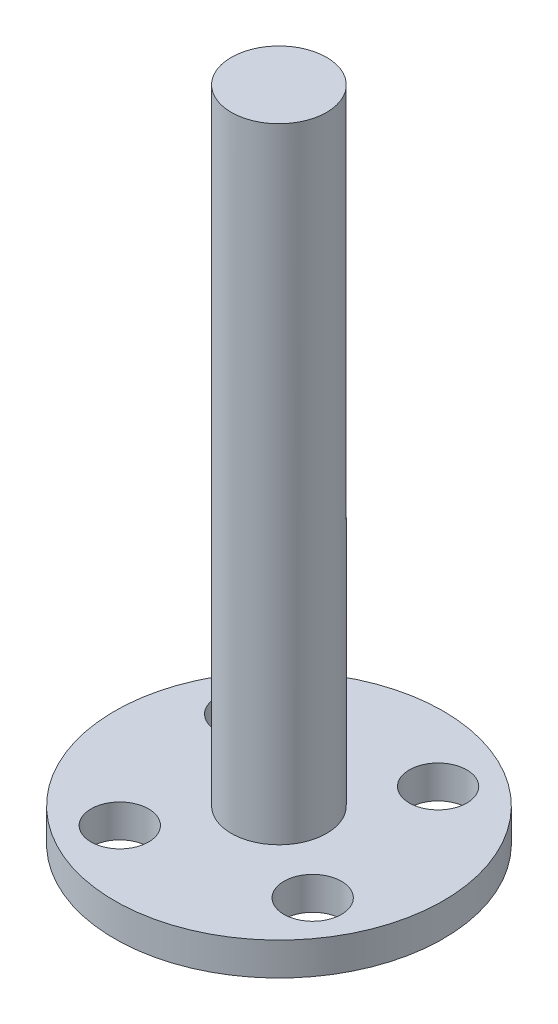
ISO-10303-21;
HEADER;
FILE_DESCRIPTION(('STEP AP214'),'2;1');
FILE_NAME('part.step','',(''),(''),'','','');
FILE_SCHEMA(('AUTOMOTIVE_DESIGN { 1 0 10303 214 1 1 1 1 }'));
ENDSEC;
DATA;
#1=APPLICATION_CONTEXT('core data for automotive mechanical design processes');
#2=APPLICATION_PROTOCOL_DEFINITION('international standard','automotive_design',2000,#1);
#3=PRODUCT_CONTEXT('',#1,'mechanical');
#4=PRODUCT('Part','Part','',(#3));
#5=PRODUCT_RELATED_PRODUCT_CATEGORY('part','',(#4));
#6=PRODUCT_DEFINITION_FORMATION('','',#4);
#7=PRODUCT_DEFINITION_CONTEXT('part definition',#1,'design');
#8=PRODUCT_DEFINITION('design','',#6,#7);
#9=PRODUCT_DEFINITION_SHAPE('','',#8);
#10=(LENGTH_UNIT() NAMED_UNIT(*) SI_UNIT(.MILLI.,.METRE.));
#11=(NAMED_UNIT(*) PLANE_ANGLE_UNIT() SI_UNIT($,.RADIAN.));
#12=(NAMED_UNIT(*) SI_UNIT($,.STERADIAN.) SOLID_ANGLE_UNIT());
#13=UNCERTAINTY_MEASURE_WITH_UNIT(LENGTH_MEASURE(1.E-05),#10,'distance_accuracy_value','');
#14=(GEOMETRIC_REPRESENTATION_CONTEXT(3) GLOBAL_UNCERTAINTY_ASSIGNED_CONTEXT((#13)) GLOBAL_UNIT_ASSIGNED_CONTEXT((#10,
#11,#12)) REPRESENTATION_CONTEXT('',''));
#15=CARTESIAN_POINT('',(0.,0.,0.));
#16=DIRECTION('',(0.,0.,1.));
#17=DIRECTION('',(1.,0.,0.));
#18=AXIS2_PLACEMENT_3D('',#15,#16,#17);
#19=CARTESIAN_POINT('',(0.,40.,0.));
#20=DIRECTION('',(0.,-1.,0.));
#21=DIRECTION('',(0.,0.,-1.));
#22=AXIS2_PLACEMENT_3D('',#19,#20,#21);
#23=CYLINDRICAL_SURFACE('',#22,2.9);
#24=CARTESIAN_POINT('',(0.,40.,0.));
#25=DIRECTION('',(0.,1.,0.));
#26=DIRECTION('',(0.,0.,1.));
#27=AXIS2_PLACEMENT_3D('',#24,#25,#26);
#28=CIRCLE('',#27,2.9);
#29=CARTESIAN_POINT('',(0.,40.,2.9));
#30=VERTEX_POINT('',#29);
#31=EDGE_CURVE('E44',#30,#30,#28,.T.);
#32=ORIENTED_EDGE('',*,*,#31,.F.);
#33=EDGE_LOOP('',(#32));
#34=FACE_BOUND('',#33,.T.);
#35=CARTESIAN_POINT('',(0.,2.,0.));
#36=DIRECTION('',(0.,-1.,0.));
#37=DIRECTION('',(0.,0.,-1.));
#38=AXIS2_PLACEMENT_3D('',#35,#36,#37);
#39=CIRCLE('',#38,2.9);
#40=CARTESIAN_POINT('',(0.,2.,-2.9));
#41=VERTEX_POINT('',#40);
#42=EDGE_CURVE('E10',#41,#41,#39,.T.);
#43=ORIENTED_EDGE('',*,*,#42,.F.);
#44=EDGE_LOOP('',(#43));
#45=FACE_BOUND('',#44,.T.);
#46=ADVANCED_FACE('F37',(#34,#45),#23,.T.);
#47=CARTESIAN_POINT('',(0.,40.,0.));
#48=DIRECTION('',(0.,1.,0.));
#49=DIRECTION('',(0.,0.,1.));
#50=AXIS2_PLACEMENT_3D('',#47,#48,#49);
#51=PLANE('',#50);
#52=ORIENTED_EDGE('',*,*,#31,.T.);
#53=EDGE_LOOP('',(#52));
#54=FACE_BOUND('',#53,.T.);
#55=ADVANCED_FACE('F101',(#54),#51,.T.);
#56=CARTESIAN_POINT('',(0.,2.,0.));
#57=DIRECTION('',(0.,-1.,0.));
#58=DIRECTION('',(0.,0.,-1.));
#59=AXIS2_PLACEMENT_3D('',#56,#57,#58);
#60=CYLINDRICAL_SURFACE('',#59,10.);
#61=CARTESIAN_POINT('',(0.,2.,0.));
#62=DIRECTION('',(0.,-1.,0.));
#63=DIRECTION('',(0.,0.,-1.));
#64=AXIS2_PLACEMENT_3D('',#61,#62,#63);
#65=CIRCLE('',#64,10.);
#66=CARTESIAN_POINT('',(0.,2.,-10.));
#67=VERTEX_POINT('',#66);
#68=EDGE_CURVE('E49',#67,#67,#65,.T.);
#69=ORIENTED_EDGE('',*,*,#68,.T.);
#70=EDGE_LOOP('',(#69));
#71=FACE_BOUND('',#70,.T.);
#72=CARTESIAN_POINT('',(0.,0.,0.));
#73=DIRECTION('',(0.,-1.,0.));
#74=DIRECTION('',(0.,0.,-1.));
#75=AXIS2_PLACEMENT_3D('',#72,#73,#74);
#76=CIRCLE('',#75,10.);
#77=CARTESIAN_POINT('',(0.,0.,-10.));
#78=VERTEX_POINT('',#77);
#79=EDGE_CURVE('E64',#78,#78,#76,.T.);
#80=ORIENTED_EDGE('',*,*,#79,.F.);
#81=EDGE_LOOP('',(#80));
#82=FACE_BOUND('',#81,.T.);
#83=ADVANCED_FACE('F92',(#71,#82),#60,.T.);
#84=CARTESIAN_POINT('',(0.,2.,0.));
#85=DIRECTION('',(0.,-1.,0.));
#86=DIRECTION('',(0.,0.,-1.));
#87=AXIS2_PLACEMENT_3D('',#84,#85,#86);
#88=PLANE('',#87);
#89=CARTESIAN_POINT('',(5.86939843416738,2.,3.81450466811861));
#90=DIRECTION('',(0.,1.,0.));
#91=DIRECTION('',(0.,0.,1.));
#92=AXIS2_PLACEMENT_3D('',#89,#90,#91);
#93=CIRCLE('',#92,1.75);
#94=CARTESIAN_POINT('',(5.86939843416738,2.,5.56450466811861));
#95=VERTEX_POINT('',#94);
#96=EDGE_CURVE('E76',#95,#95,#93,.T.);
#97=ORIENTED_EDGE('',*,*,#96,.F.);
#98=EDGE_LOOP('',(#97));
#99=FACE_BOUND('',#98,.T.);
#100=CARTESIAN_POINT('',(3.8145046681184,2.,-5.869398434167));
#101=DIRECTION('',(0.,1.,0.));
#102=DIRECTION('',(0.,0.,1.));
#103=AXIS2_PLACEMENT_3D('',#100,#101,#102);
#104=CIRCLE('',#103,1.75);
#105=CARTESIAN_POINT('',(3.8145046681184,2.,-4.119398434167));
#106=VERTEX_POINT('',#105);
#107=EDGE_CURVE('E79',#106,#106,#104,.T.);
#108=ORIENTED_EDGE('',*,*,#107,.F.);
#109=EDGE_LOOP('',(#108));
#110=FACE_BOUND('',#109,.T.);
#111=CARTESIAN_POINT('',(-5.86939843416722,2.,-3.81450466811802));
#112=DIRECTION('',(0.,1.,0.));
#113=DIRECTION('',(0.,0.,1.));
#114=AXIS2_PLACEMENT_3D('',#111,#112,#113);
#115=CIRCLE('',#114,1.74999999999821);
#116=CARTESIAN_POINT('',(-5.86939843416722,2.,-2.06450466811981));
#117=VERTEX_POINT('',#116);
#118=EDGE_CURVE('E75',#117,#117,#115,.T.);
#119=ORIENTED_EDGE('',*,*,#118,.F.);
#120=EDGE_LOOP('',(#119));
#121=FACE_BOUND('',#120,.T.);
#122=CARTESIAN_POINT('',(-3.81450466811824,2.,5.86939843416759));
#123=DIRECTION('',(0.,1.,0.));
#124=DIRECTION('',(0.,0.,1.));
#125=AXIS2_PLACEMENT_3D('',#122,#123,#124);
#126=CIRCLE('',#125,1.75);
#127=CARTESIAN_POINT('',(-3.81450466811824,2.,7.61939843416759));
#128=VERTEX_POINT('',#127);
#129=EDGE_CURVE('E57',#128,#128,#126,.T.);
#130=ORIENTED_EDGE('',*,*,#129,.F.);
#131=EDGE_LOOP('',(#130));
#132=FACE_BOUND('',#131,.T.);
#133=ORIENTED_EDGE('',*,*,#42,.T.);
#134=EDGE_LOOP('',(#133));
#135=FACE_BOUND('',#134,.T.);
#136=ORIENTED_EDGE('',*,*,#68,.F.);
#137=EDGE_LOOP('',(#136));
#138=FACE_BOUND('',#137,.T.);
#139=ADVANCED_FACE('F88',(#99,#110,#121,#132,#135,#138),#88,.F.);
#140=CARTESIAN_POINT('',(0.,0.,0.));
#141=DIRECTION('',(0.,1.,0.));
#142=DIRECTION('',(0.,0.,1.));
#143=AXIS2_PLACEMENT_3D('',#140,#141,#142);
#144=PLANE('',#143);
#145=CARTESIAN_POINT('',(5.86939843416738,0.,3.81450466811861));
#146=DIRECTION('',(0.,1.,0.));
#147=DIRECTION('',(0.,0.,1.));
#148=AXIS2_PLACEMENT_3D('',#145,#146,#147);
#149=CIRCLE('',#148,1.75);
#150=CARTESIAN_POINT('',(5.86939843416738,0.,5.56450466811861));
#151=VERTEX_POINT('',#150);
#152=EDGE_CURVE('E40',#151,#151,#149,.T.);
#153=ORIENTED_EDGE('',*,*,#152,.T.);
#154=EDGE_LOOP('',(#153));
#155=FACE_BOUND('',#154,.T.);
#156=CARTESIAN_POINT('',(3.8145046681184,0.,-5.869398434167));
#157=DIRECTION('',(0.,1.,0.));
#158=DIRECTION('',(0.,0.,1.));
#159=AXIS2_PLACEMENT_3D('',#156,#157,#158);
#160=CIRCLE('',#159,1.75);
#161=CARTESIAN_POINT('',(3.8145046681184,0.,-4.119398434167));
#162=VERTEX_POINT('',#161);
#163=EDGE_CURVE('E59',#162,#162,#160,.T.);
#164=ORIENTED_EDGE('',*,*,#163,.T.);
#165=EDGE_LOOP('',(#164));
#166=FACE_BOUND('',#165,.T.);
#167=CARTESIAN_POINT('',(-5.86939843416722,0.,-3.81450466811802));
#168=DIRECTION('',(0.,1.,0.));
#169=DIRECTION('',(0.,0.,1.));
#170=AXIS2_PLACEMENT_3D('',#167,#168,#169);
#171=CIRCLE('',#170,1.74999999999821);
#172=CARTESIAN_POINT('',(-5.86939843416722,0.,-2.06450466811981));
#173=VERTEX_POINT('',#172);
#174=EDGE_CURVE('E56',#173,#173,#171,.T.);
#175=ORIENTED_EDGE('',*,*,#174,.T.);
#176=EDGE_LOOP('',(#175));
#177=FACE_BOUND('',#176,.T.);
#178=CARTESIAN_POINT('',(-3.81450466811824,0.,5.86939843416759));
#179=DIRECTION('',(0.,1.,0.));
#180=DIRECTION('',(0.,0.,1.));
#181=AXIS2_PLACEMENT_3D('',#178,#179,#180);
#182=CIRCLE('',#181,1.75);
#183=CARTESIAN_POINT('',(-3.81450466811824,0.,7.61939843416759));
#184=VERTEX_POINT('',#183);
#185=EDGE_CURVE('E53',#184,#184,#182,.T.);
#186=ORIENTED_EDGE('',*,*,#185,.T.);
#187=EDGE_LOOP('',(#186));
#188=FACE_BOUND('',#187,.T.);
#189=ORIENTED_EDGE('',*,*,#79,.T.);
#190=EDGE_LOOP('',(#189));
#191=FACE_BOUND('',#190,.T.);
#192=ADVANCED_FACE('F91',(#155,#166,#177,#188,#191),#144,.F.);
#193=CARTESIAN_POINT('',(-3.81450466811824,-1.,5.86939843416759));
#194=DIRECTION('',(0.,1.,0.));
#195=DIRECTION('',(0.,0.,1.));
#196=AXIS2_PLACEMENT_3D('',#193,#194,#195);
#197=CYLINDRICAL_SURFACE('',#196,1.75);
#198=ORIENTED_EDGE('',*,*,#129,.T.);
#199=EDGE_LOOP('',(#198));
#200=FACE_BOUND('',#199,.T.);
#201=ORIENTED_EDGE('',*,*,#185,.F.);
#202=EDGE_LOOP('',(#201));
#203=FACE_BOUND('',#202,.T.);
#204=ADVANCED_FACE('F131',(#200,#203),#197,.F.);
#205=CARTESIAN_POINT('',(-5.86939843416722,-1.,-3.81450466811802));
#206=DIRECTION('',(0.,1.,0.));
#207=DIRECTION('',(0.,0.,1.));
#208=AXIS2_PLACEMENT_3D('',#205,#206,#207);
#209=CYLINDRICAL_SURFACE('',#208,1.74999999999821);
#210=ORIENTED_EDGE('',*,*,#118,.T.);
#211=EDGE_LOOP('',(#210));
#212=FACE_BOUND('',#211,.T.);
#213=ORIENTED_EDGE('',*,*,#174,.F.);
#214=EDGE_LOOP('',(#213));
#215=FACE_BOUND('',#214,.T.);
#216=ADVANCED_FACE('F85',(#212,#215),#209,.F.);
#217=CARTESIAN_POINT('',(3.8145046681184,-1.,-5.869398434167));
#218=DIRECTION('',(0.,1.,0.));
#219=DIRECTION('',(0.,0.,1.));
#220=AXIS2_PLACEMENT_3D('',#217,#218,#219);
#221=CYLINDRICAL_SURFACE('',#220,1.75);
#222=ORIENTED_EDGE('',*,*,#107,.T.);
#223=EDGE_LOOP('',(#222));
#224=FACE_BOUND('',#223,.T.);
#225=ORIENTED_EDGE('',*,*,#163,.F.);
#226=EDGE_LOOP('',(#225));
#227=FACE_BOUND('',#226,.T.);
#228=ADVANCED_FACE('F170',(#224,#227),#221,.F.);
#229=CARTESIAN_POINT('',(5.86939843416738,-1.,3.81450466811861));
#230=DIRECTION('',(0.,1.,0.));
#231=DIRECTION('',(0.,0.,1.));
#232=AXIS2_PLACEMENT_3D('',#229,#230,#231);
#233=CYLINDRICAL_SURFACE('',#232,1.75);
#234=ORIENTED_EDGE('',*,*,#96,.T.);
#235=EDGE_LOOP('',(#234));
#236=FACE_BOUND('',#235,.T.);
#237=ORIENTED_EDGE('',*,*,#152,.F.);
#238=EDGE_LOOP('',(#237));
#239=FACE_BOUND('',#238,.T.);
#240=ADVANCED_FACE('F180',(#236,#239),#233,.F.);
#241=CLOSED_SHELL('',(#46,#55,#83,#139,#192,#204,#216,#228,#240));
#242=MANIFOLD_SOLID_BREP('B2',#241);
#243=ADVANCED_BREP_SHAPE_REPRESENTATION('',(#18,#242),#14);
#244=SHAPE_DEFINITION_REPRESENTATION(#9,#243);
ENDSEC;
END-ISO-10303-21;
